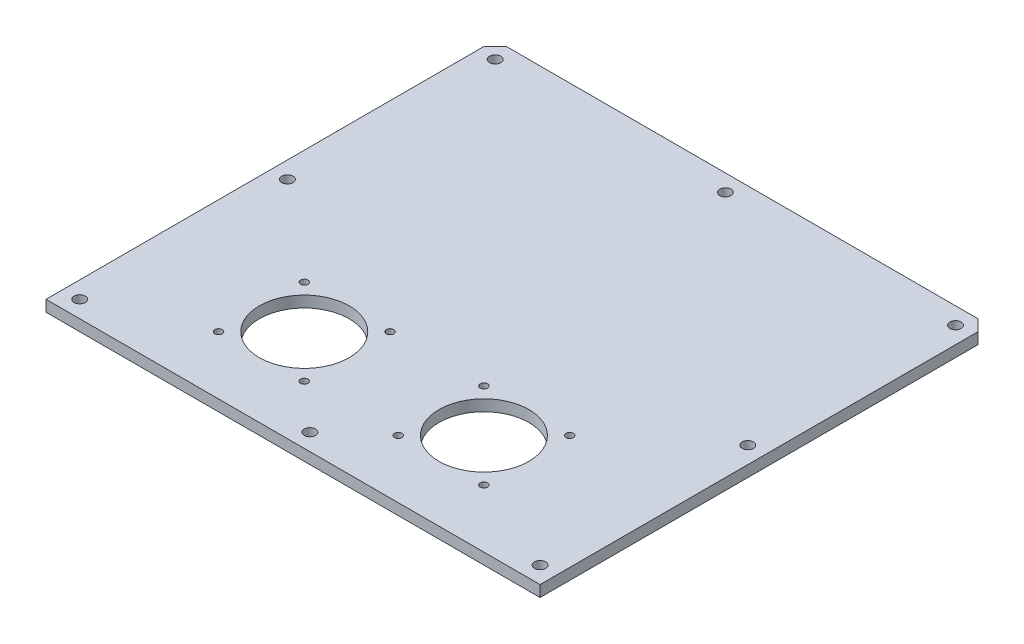
ISO-10303-21;
HEADER;
FILE_DESCRIPTION(('STEP AP214'),'2;1');
FILE_NAME('part.step','',(''),(''),'','','');
FILE_SCHEMA(('AUTOMOTIVE_DESIGN { 1 0 10303 214 1 1 1 1 }'));
ENDSEC;
DATA;
#1=APPLICATION_CONTEXT('core data for automotive mechanical design processes');
#2=APPLICATION_PROTOCOL_DEFINITION('international standard','automotive_design',2000,#1);
#3=PRODUCT_CONTEXT('',#1,'mechanical');
#4=PRODUCT('Part','Part','',(#3));
#5=PRODUCT_RELATED_PRODUCT_CATEGORY('part','',(#4));
#6=PRODUCT_DEFINITION_FORMATION('','',#4);
#7=PRODUCT_DEFINITION_CONTEXT('part definition',#1,'design');
#8=PRODUCT_DEFINITION('design','',#6,#7);
#9=PRODUCT_DEFINITION_SHAPE('','',#8);
#10=(LENGTH_UNIT() NAMED_UNIT(*) SI_UNIT(.MILLI.,.METRE.));
#11=(NAMED_UNIT(*) PLANE_ANGLE_UNIT() SI_UNIT($,.RADIAN.));
#12=(NAMED_UNIT(*) SI_UNIT($,.STERADIAN.) SOLID_ANGLE_UNIT());
#13=UNCERTAINTY_MEASURE_WITH_UNIT(LENGTH_MEASURE(1.E-05),#10,'distance_accuracy_value','');
#14=(GEOMETRIC_REPRESENTATION_CONTEXT(3) GLOBAL_UNCERTAINTY_ASSIGNED_CONTEXT((#13)) GLOBAL_UNIT_ASSIGNED_CONTEXT((#10,
#11,#12)) REPRESENTATION_CONTEXT('',''));
#15=CARTESIAN_POINT('',(0.,0.,0.));
#16=DIRECTION('',(0.,0.,1.));
#17=DIRECTION('',(1.,0.,0.));
#18=AXIS2_PLACEMENT_3D('',#15,#16,#17);
#19=CARTESIAN_POINT('',(0.,0.,0.));
#20=DIRECTION('',(0.,1.,0.));
#21=DIRECTION('',(0.,0.,1.));
#22=AXIS2_PLACEMENT_3D('',#19,#20,#21);
#23=PLANE('',#22);
#24=CARTESIAN_POINT('',(-102.5,0.,-42.5));
#25=DIRECTION('',(0.,1.,0.));
#26=DIRECTION('',(0.,0.,1.));
#27=AXIS2_PLACEMENT_3D('',#24,#25,#26);
#28=CIRCLE('',#27,2.5);
#29=CARTESIAN_POINT('',(-102.5,0.,-40.));
#30=VERTEX_POINT('',#29);
#31=EDGE_CURVE('E857',#30,#30,#28,.T.);
#32=ORIENTED_EDGE('',*,*,#31,.T.);
#33=EDGE_LOOP('',(#32));
#34=FACE_BOUND('',#33,.T.);
#35=CARTESIAN_POINT('',(0.,0.,-42.5));
#36=DIRECTION('',(0.,1.,0.));
#37=DIRECTION('',(0.,0.,1.));
#38=AXIS2_PLACEMENT_3D('',#35,#36,#37);
#39=CIRCLE('',#38,2.49999999999999);
#40=CARTESIAN_POINT('',(0.,0.,-40.));
#41=VERTEX_POINT('',#40);
#42=EDGE_CURVE('E70',#41,#41,#39,.T.);
#43=ORIENTED_EDGE('',*,*,#42,.T.);
#44=EDGE_LOOP('',(#43));
#45=FACE_BOUND('',#44,.T.);
#46=CARTESIAN_POINT('',(102.5,0.,-42.5));
#47=DIRECTION('',(0.,1.,0.));
#48=DIRECTION('',(0.,0.,1.));
#49=AXIS2_PLACEMENT_3D('',#46,#47,#48);
#50=CIRCLE('',#49,2.5);
#51=CARTESIAN_POINT('',(102.5,0.,-40.));
#52=VERTEX_POINT('',#51);
#53=EDGE_CURVE('E324',#52,#52,#50,.T.);
#54=ORIENTED_EDGE('',*,*,#53,.T.);
#55=EDGE_LOOP('',(#54));
#56=FACE_BOUND('',#55,.T.);
#57=CARTESIAN_POINT('',(102.500000000001,0.,49.9999999999971));
#58=DIRECTION('',(0.,1.,0.));
#59=DIRECTION('',(0.,0.,1.));
#60=AXIS2_PLACEMENT_3D('',#57,#58,#59);
#61=CIRCLE('',#60,2.5);
#62=CARTESIAN_POINT('',(102.500000000001,0.,52.4999999999971));
#63=VERTEX_POINT('',#62);
#64=EDGE_CURVE('E331',#63,#63,#61,.T.);
#65=ORIENTED_EDGE('',*,*,#64,.T.);
#66=EDGE_LOOP('',(#65));
#67=FACE_BOUND('',#66,.T.);
#68=CARTESIAN_POINT('',(-102.499999999999,0.,50.));
#69=DIRECTION('',(0.,1.,0.));
#70=DIRECTION('',(0.,0.,1.));
#71=AXIS2_PLACEMENT_3D('',#68,#69,#70);
#72=CIRCLE('',#71,2.5);
#73=CARTESIAN_POINT('',(-102.499999999999,0.,52.5));
#74=VERTEX_POINT('',#73);
#75=EDGE_CURVE('E321',#74,#74,#72,.T.);
#76=ORIENTED_EDGE('',*,*,#75,.T.);
#77=EDGE_LOOP('',(#76));
#78=FACE_BOUND('',#77,.T.);
#79=CARTESIAN_POINT('',(-102.499999999998,0.,142.5));
#80=DIRECTION('',(0.,1.,0.));
#81=DIRECTION('',(0.,0.,1.));
#82=AXIS2_PLACEMENT_3D('',#79,#80,#81);
#83=CIRCLE('',#82,2.5);
#84=CARTESIAN_POINT('',(-102.499999999998,0.,145.));
#85=VERTEX_POINT('',#84);
#86=EDGE_CURVE('E317',#85,#85,#83,.T.);
#87=ORIENTED_EDGE('',*,*,#86,.T.);
#88=EDGE_LOOP('',(#87));
#89=FACE_BOUND('',#88,.T.);
#90=CARTESIAN_POINT('',(1.92901250528621E-12,0.,142.5));
#91=DIRECTION('',(0.,1.,0.));
#92=DIRECTION('',(0.,0.,1.));
#93=AXIS2_PLACEMENT_3D('',#90,#91,#92);
#94=CIRCLE('',#93,2.49999999999999);
#95=CARTESIAN_POINT('',(1.92901250528621E-12,0.,145.));
#96=VERTEX_POINT('',#95);
#97=EDGE_CURVE('E312',#96,#96,#94,.T.);
#98=ORIENTED_EDGE('',*,*,#97,.T.);
#99=EDGE_LOOP('',(#98));
#100=FACE_BOUND('',#99,.T.);
#101=CARTESIAN_POINT('',(102.500000000002,0.,142.5));
#102=DIRECTION('',(0.,1.,0.));
#103=DIRECTION('',(0.,0.,1.));
#104=AXIS2_PLACEMENT_3D('',#101,#102,#103);
#105=CIRCLE('',#104,2.5);
#106=CARTESIAN_POINT('',(102.500000000002,0.,145.));
#107=VERTEX_POINT('',#106);
#108=EDGE_CURVE('E352',#107,#107,#105,.T.);
#109=ORIENTED_EDGE('',*,*,#108,.T.);
#110=EDGE_LOOP('',(#109));
#111=FACE_BOUND('',#110,.T.);
#112=DIRECTION('',(0.,0.,1.));
#113=VECTOR('',#112,1.);
#114=CARTESIAN_POINT('',(-95.,0.,0.));
#115=LINE('',#114,#113);
#116=CARTESIAN_POINT('',(-95.,0.,-35.));
#117=VERTEX_POINT('',#116);
#118=CARTESIAN_POINT('',(-95.,0.,135.));
#119=VERTEX_POINT('',#118);
#120=EDGE_CURVE('E226',#117,#119,#115,.T.);
#121=ORIENTED_EDGE('',*,*,#120,.T.);
#122=DIRECTION('',(1.,0.,0.));
#123=VECTOR('',#122,1.);
#124=CARTESIAN_POINT('',(0.,0.,135.));
#125=LINE('',#124,#123);
#126=CARTESIAN_POINT('',(95.,0.,135.));
#127=VERTEX_POINT('',#126);
#128=EDGE_CURVE('E198',#119,#127,#125,.T.);
#129=ORIENTED_EDGE('',*,*,#128,.T.);
#130=DIRECTION('',(0.,0.,-1.));
#131=VECTOR('',#130,1.);
#132=CARTESIAN_POINT('',(95.,0.,0.));
#133=LINE('',#132,#131);
#134=CARTESIAN_POINT('',(95.,0.,-35.));
#135=VERTEX_POINT('',#134);
#136=EDGE_CURVE('E232',#127,#135,#133,.T.);
#137=ORIENTED_EDGE('',*,*,#136,.T.);
#138=DIRECTION('',(-1.,0.,0.));
#139=VECTOR('',#138,1.);
#140=CARTESIAN_POINT('',(0.,0.,-35.));
#141=LINE('',#140,#139);
#142=EDGE_CURVE('E229',#135,#117,#141,.T.);
#143=ORIENTED_EDGE('',*,*,#142,.T.);
#144=EDGE_LOOP('',(#121,#129,#137,#143));
#145=FACE_BOUND('',#144,.T.);
#146=DIRECTION('',(-1.,0.,0.));
#147=VECTOR('',#146,1.);
#148=CARTESIAN_POINT('',(110.,0.,-50.));
#149=LINE('',#148,#147);
#150=CARTESIAN_POINT('',(105.,0.,-50.));
#151=VERTEX_POINT('',#150);
#152=CARTESIAN_POINT('',(-105.,0.,-50.));
#153=VERTEX_POINT('',#152);
#154=EDGE_CURVE('E248',#151,#153,#149,.T.);
#155=ORIENTED_EDGE('',*,*,#154,.F.);
#156=DIRECTION('',(-0.707106781186546,0.,-0.707106781186549));
#157=VECTOR('',#156,1.);
#158=CARTESIAN_POINT('',(105.,0.,-50.));
#159=LINE('',#158,#157);
#160=CARTESIAN_POINT('',(110.,0.,-45.));
#161=VERTEX_POINT('',#160);
#162=EDGE_CURVE('E276',#151,#161,#159,.F.);
#163=ORIENTED_EDGE('',*,*,#162,.T.);
#164=DIRECTION('',(0.,0.,-1.));
#165=VECTOR('',#164,1.);
#166=CARTESIAN_POINT('',(110.,0.,150.));
#167=LINE('',#166,#165);
#168=CARTESIAN_POINT('',(110.,0.,150.));
#169=VERTEX_POINT('',#168);
#170=EDGE_CURVE('E259',#169,#161,#167,.T.);
#171=ORIENTED_EDGE('',*,*,#170,.F.);
#172=DIRECTION('',(1.,0.,0.));
#173=VECTOR('',#172,1.);
#174=CARTESIAN_POINT('',(-110.,0.,150.));
#175=LINE('',#174,#173);
#176=CARTESIAN_POINT('',(-110.,0.,150.));
#177=VERTEX_POINT('',#176);
#178=EDGE_CURVE('E257',#177,#169,#175,.T.);
#179=ORIENTED_EDGE('',*,*,#178,.F.);
#180=DIRECTION('',(0.,0.,1.));
#181=VECTOR('',#180,1.);
#182=CARTESIAN_POINT('',(-110.,0.,-50.));
#183=LINE('',#182,#181);
#184=CARTESIAN_POINT('',(-110.,0.,-45.));
#185=VERTEX_POINT('',#184);
#186=EDGE_CURVE('E243',#185,#177,#183,.T.);
#187=ORIENTED_EDGE('',*,*,#186,.F.);
#188=DIRECTION('',(-0.707106781186549,0.,0.707106781186546));
#189=VECTOR('',#188,1.);
#190=CARTESIAN_POINT('',(-110.,0.,-45.));
#191=LINE('',#190,#189);
#192=EDGE_CURVE('E274',#185,#153,#191,.F.);
#193=ORIENTED_EDGE('',*,*,#192,.T.);
#194=EDGE_LOOP('',(#155,#163,#171,#179,#187,#193));
#195=FACE_BOUND('',#194,.T.);
#196=ADVANCED_FACE('F66',(#34,#45,#56,#67,#78,#89,#100,#111,#145,#195),#23,.F.);
#197=CARTESIAN_POINT('',(-110.,5.,-50.));
#198=DIRECTION('',(1.,0.,0.));
#199=DIRECTION('',(0.,0.,-1.));
#200=AXIS2_PLACEMENT_3D('',#197,#198,#199);
#201=PLANE('',#200);
#202=DIRECTION('',(0.,0.,1.));
#203=VECTOR('',#202,1.);
#204=CARTESIAN_POINT('',(-110.,5.,-50.));
#205=LINE('',#204,#203);
#206=CARTESIAN_POINT('',(-110.,5.,-45.));
#207=VERTEX_POINT('',#206);
#208=CARTESIAN_POINT('',(-110.,5.,150.));
#209=VERTEX_POINT('',#208);
#210=EDGE_CURVE('E247',#207,#209,#205,.T.);
#211=ORIENTED_EDGE('',*,*,#210,.F.);
#212=DIRECTION('',(0.,-1.,0.));
#213=VECTOR('',#212,1.);
#214=CARTESIAN_POINT('',(-110.,5.,-45.));
#215=LINE('',#214,#213);
#216=EDGE_CURVE('E284',#207,#185,#215,.T.);
#217=ORIENTED_EDGE('',*,*,#216,.T.);
#218=ORIENTED_EDGE('',*,*,#186,.T.);
#219=DIRECTION('',(0.,-1.,0.));
#220=VECTOR('',#219,1.);
#221=CARTESIAN_POINT('',(-110.,5.,150.));
#222=LINE('',#221,#220);
#223=EDGE_CURVE('E266',#209,#177,#222,.T.);
#224=ORIENTED_EDGE('',*,*,#223,.F.);
#225=EDGE_LOOP('',(#211,#217,#218,#224));
#226=FACE_BOUND('',#225,.T.);
#227=ADVANCED_FACE('F406',(#226),#201,.F.);
#228=CARTESIAN_POINT('',(-110.,5.,150.));
#229=DIRECTION('',(0.,0.,-1.));
#230=DIRECTION('',(-1.,0.,0.));
#231=AXIS2_PLACEMENT_3D('',#228,#229,#230);
#232=PLANE('',#231);
#233=ORIENTED_EDGE('',*,*,#178,.T.);
#234=DIRECTION('',(0.,-1.,0.));
#235=VECTOR('',#234,1.);
#236=CARTESIAN_POINT('',(110.,5.,150.));
#237=LINE('',#236,#235);
#238=CARTESIAN_POINT('',(110.,5.,150.));
#239=VERTEX_POINT('',#238);
#240=EDGE_CURVE('E255',#239,#169,#237,.T.);
#241=ORIENTED_EDGE('',*,*,#240,.F.);
#242=DIRECTION('',(1.,0.,0.));
#243=VECTOR('',#242,1.);
#244=CARTESIAN_POINT('',(-110.,5.,150.));
#245=LINE('',#244,#243);
#246=EDGE_CURVE('E250',#209,#239,#245,.T.);
#247=ORIENTED_EDGE('',*,*,#246,.F.);
#248=ORIENTED_EDGE('',*,*,#223,.T.);
#249=EDGE_LOOP('',(#233,#241,#247,#248));
#250=FACE_BOUND('',#249,.T.);
#251=ADVANCED_FACE('F409',(#250),#232,.F.);
#252=CARTESIAN_POINT('',(110.,5.,150.));
#253=DIRECTION('',(-1.,0.,0.));
#254=DIRECTION('',(0.,0.,1.));
#255=AXIS2_PLACEMENT_3D('',#252,#253,#254);
#256=PLANE('',#255);
#257=ORIENTED_EDGE('',*,*,#170,.T.);
#258=DIRECTION('',(0.,1.,0.));
#259=VECTOR('',#258,1.);
#260=CARTESIAN_POINT('',(110.,5.,-45.));
#261=LINE('',#260,#259);
#262=CARTESIAN_POINT('',(110.,5.,-45.));
#263=VERTEX_POINT('',#262);
#264=EDGE_CURVE('E278',#161,#263,#261,.T.);
#265=ORIENTED_EDGE('',*,*,#264,.T.);
#266=DIRECTION('',(0.,0.,-1.));
#267=VECTOR('',#266,1.);
#268=CARTESIAN_POINT('',(110.,5.,150.));
#269=LINE('',#268,#267);
#270=EDGE_CURVE('E252',#239,#263,#269,.T.);
#271=ORIENTED_EDGE('',*,*,#270,.F.);
#272=ORIENTED_EDGE('',*,*,#240,.T.);
#273=EDGE_LOOP('',(#257,#265,#271,#272));
#274=FACE_BOUND('',#273,.T.);
#275=ADVANCED_FACE('F410',(#274),#256,.F.);
#276=CARTESIAN_POINT('',(110.,5.,-50.));
#277=DIRECTION('',(0.,0.,1.));
#278=DIRECTION('',(1.,0.,0.));
#279=AXIS2_PLACEMENT_3D('',#276,#277,#278);
#280=PLANE('',#279);
#281=DIRECTION('',(-1.,0.,0.));
#282=VECTOR('',#281,1.);
#283=CARTESIAN_POINT('',(0.,5.,-50.));
#284=LINE('',#283,#282);
#285=CARTESIAN_POINT('',(105.,5.,-50.));
#286=VERTEX_POINT('',#285);
#287=CARTESIAN_POINT('',(-105.,5.,-50.));
#288=VERTEX_POINT('',#287);
#289=EDGE_CURVE('E244',#286,#288,#284,.T.);
#290=ORIENTED_EDGE('',*,*,#289,.F.);
#291=DIRECTION('',(0.,-1.,0.));
#292=VECTOR('',#291,1.);
#293=CARTESIAN_POINT('',(105.,5.,-50.));
#294=LINE('',#293,#292);
#295=EDGE_CURVE('E271',#286,#151,#294,.T.);
#296=ORIENTED_EDGE('',*,*,#295,.T.);
#297=ORIENTED_EDGE('',*,*,#154,.T.);
#298=DIRECTION('',(0.,1.,0.));
#299=VECTOR('',#298,1.);
#300=CARTESIAN_POINT('',(-105.,5.,-50.));
#301=LINE('',#300,#299);
#302=EDGE_CURVE('E269',#153,#288,#301,.T.);
#303=ORIENTED_EDGE('',*,*,#302,.T.);
#304=EDGE_LOOP('',(#290,#296,#297,#303));
#305=FACE_BOUND('',#304,.T.);
#306=ADVANCED_FACE('F381',(#305),#280,.F.);
#307=CARTESIAN_POINT('',(0.,5.,0.));
#308=DIRECTION('',(0.,1.,0.));
#309=DIRECTION('',(0.,0.,1.));
#310=AXIS2_PLACEMENT_3D('',#307,#308,#309);
#311=PLANE('',#310);
#312=CARTESIAN_POINT('',(-59.0918830920369,5.,85.9081169079554));
#313=DIRECTION('',(0.,1.,0.));
#314=DIRECTION('',(0.,0.,1.));
#315=AXIS2_PLACEMENT_3D('',#312,#313,#314);
#316=CIRCLE('',#315,1.65);
#317=CARTESIAN_POINT('',(-59.0918830920369,5.,87.5581169079554));
#318=VERTEX_POINT('',#317);
#319=EDGE_CURVE('E823',#318,#318,#316,.T.);
#320=ORIENTED_EDGE('',*,*,#319,.F.);
#321=EDGE_LOOP('',(#320));
#322=FACE_BOUND('',#321,.T.);
#323=CARTESIAN_POINT('',(-20.9081169079633,5.,85.9081169079547));
#324=DIRECTION('',(0.,1.,0.));
#325=DIRECTION('',(0.,0.,1.));
#326=AXIS2_PLACEMENT_3D('',#323,#324,#325);
#327=CIRCLE('',#326,1.65);
#328=CARTESIAN_POINT('',(-20.9081169079633,5.,87.5581169079547));
#329=VERTEX_POINT('',#328);
#330=EDGE_CURVE('E825',#329,#329,#327,.T.);
#331=ORIENTED_EDGE('',*,*,#330,.F.);
#332=EDGE_LOOP('',(#331));
#333=FACE_BOUND('',#332,.T.);
#334=CARTESIAN_POINT('',(-20.9081169079628,5.,124.091883092028));
#335=DIRECTION('',(0.,1.,0.));
#336=DIRECTION('',(0.,0.,1.));
#337=AXIS2_PLACEMENT_3D('',#334,#335,#336);
#338=CIRCLE('',#337,1.65);
#339=CARTESIAN_POINT('',(-20.9081169079628,5.,125.741883092028));
#340=VERTEX_POINT('',#339);
#341=EDGE_CURVE('E831',#340,#340,#338,.T.);
#342=ORIENTED_EDGE('',*,*,#341,.F.);
#343=EDGE_LOOP('',(#342));
#344=FACE_BOUND('',#343,.T.);
#345=CARTESIAN_POINT('',(-59.0918830920363,5.,124.091883092029));
#346=DIRECTION('',(0.,1.,0.));
#347=DIRECTION('',(0.,0.,1.));
#348=AXIS2_PLACEMENT_3D('',#345,#346,#347);
#349=CIRCLE('',#348,1.65);
#350=CARTESIAN_POINT('',(-59.0918830920363,5.,125.741883092029));
#351=VERTEX_POINT('',#350);
#352=EDGE_CURVE('E835',#351,#351,#349,.T.);
#353=ORIENTED_EDGE('',*,*,#352,.F.);
#354=EDGE_LOOP('',(#353));
#355=FACE_BOUND('',#354,.T.);
#356=CARTESIAN_POINT('',(20.9081169079631,5.,85.9081169079554));
#357=DIRECTION('',(0.,1.,0.));
#358=DIRECTION('',(0.,0.,1.));
#359=AXIS2_PLACEMENT_3D('',#356,#357,#358);
#360=CIRCLE('',#359,1.65);
#361=CARTESIAN_POINT('',(20.9081169079631,5.,87.5581169079554));
#362=VERTEX_POINT('',#361);
#363=EDGE_CURVE('E839',#362,#362,#360,.T.);
#364=ORIENTED_EDGE('',*,*,#363,.F.);
#365=EDGE_LOOP('',(#364));
#366=FACE_BOUND('',#365,.T.);
#367=CARTESIAN_POINT('',(59.0918830920367,5.,85.9081169079547));
#368=DIRECTION('',(0.,1.,0.));
#369=DIRECTION('',(0.,0.,1.));
#370=AXIS2_PLACEMENT_3D('',#367,#368,#369);
#371=CIRCLE('',#370,1.65);
#372=CARTESIAN_POINT('',(59.0918830920367,5.,87.5581169079547));
#373=VERTEX_POINT('',#372);
#374=EDGE_CURVE('E843',#373,#373,#371,.T.);
#375=ORIENTED_EDGE('',*,*,#374,.F.);
#376=EDGE_LOOP('',(#375));
#377=FACE_BOUND('',#376,.T.);
#378=CARTESIAN_POINT('',(59.0918830920372,5.,124.091883092028));
#379=DIRECTION('',(0.,1.,0.));
#380=DIRECTION('',(0.,0.,1.));
#381=AXIS2_PLACEMENT_3D('',#378,#379,#380);
#382=CIRCLE('',#381,1.65);
#383=CARTESIAN_POINT('',(59.0918830920372,5.,125.741883092028));
#384=VERTEX_POINT('',#383);
#385=EDGE_CURVE('E847',#384,#384,#382,.T.);
#386=ORIENTED_EDGE('',*,*,#385,.F.);
#387=EDGE_LOOP('',(#386));
#388=FACE_BOUND('',#387,.T.);
#389=CARTESIAN_POINT('',(20.9081169079637,5.,124.091883092029));
#390=DIRECTION('',(0.,1.,0.));
#391=DIRECTION('',(0.,0.,1.));
#392=AXIS2_PLACEMENT_3D('',#389,#390,#391);
#393=CIRCLE('',#392,1.65);
#394=CARTESIAN_POINT('',(20.9081169079637,5.,125.741883092029));
#395=VERTEX_POINT('',#394);
#396=EDGE_CURVE('E851',#395,#395,#393,.T.);
#397=ORIENTED_EDGE('',*,*,#396,.F.);
#398=EDGE_LOOP('',(#397));
#399=FACE_BOUND('',#398,.T.);
#400=CARTESIAN_POINT('',(-102.5,5.,-42.5));
#401=DIRECTION('',(0.,1.,0.));
#402=DIRECTION('',(0.,0.,1.));
#403=AXIS2_PLACEMENT_3D('',#400,#401,#402);
#404=CIRCLE('',#403,2.49999999999999);
#405=CARTESIAN_POINT('',(-102.5,5.,-40.));
#406=VERTEX_POINT('',#405);
#407=EDGE_CURVE('E855',#406,#406,#404,.T.);
#408=ORIENTED_EDGE('',*,*,#407,.F.);
#409=EDGE_LOOP('',(#408));
#410=FACE_BOUND('',#409,.T.);
#411=CARTESIAN_POINT('',(0.,5.,-42.5));
#412=DIRECTION('',(0.,1.,0.));
#413=DIRECTION('',(0.,0.,1.));
#414=AXIS2_PLACEMENT_3D('',#411,#412,#413);
#415=CIRCLE('',#414,2.49999999999999);
#416=CARTESIAN_POINT('',(0.,5.,-40.));
#417=VERTEX_POINT('',#416);
#418=EDGE_CURVE('E338',#417,#417,#415,.T.);
#419=ORIENTED_EDGE('',*,*,#418,.F.);
#420=EDGE_LOOP('',(#419));
#421=FACE_BOUND('',#420,.T.);
#422=CARTESIAN_POINT('',(102.5,5.,-42.5));
#423=DIRECTION('',(0.,1.,0.));
#424=DIRECTION('',(0.,0.,1.));
#425=AXIS2_PLACEMENT_3D('',#422,#423,#424);
#426=CIRCLE('',#425,2.49999999999999);
#427=CARTESIAN_POINT('',(102.5,5.,-40.));
#428=VERTEX_POINT('',#427);
#429=EDGE_CURVE('E327',#428,#428,#426,.T.);
#430=ORIENTED_EDGE('',*,*,#429,.F.);
#431=EDGE_LOOP('',(#430));
#432=FACE_BOUND('',#431,.T.);
#433=CARTESIAN_POINT('',(102.500000000001,5.,49.9999999999971));
#434=DIRECTION('',(0.,1.,0.));
#435=DIRECTION('',(0.,0.,1.));
#436=AXIS2_PLACEMENT_3D('',#433,#434,#435);
#437=CIRCLE('',#436,2.49999999999999);
#438=CARTESIAN_POINT('',(102.500000000001,5.,52.4999999999971));
#439=VERTEX_POINT('',#438);
#440=EDGE_CURVE('E326',#439,#439,#437,.T.);
#441=ORIENTED_EDGE('',*,*,#440,.F.);
#442=EDGE_LOOP('',(#441));
#443=FACE_BOUND('',#442,.T.);
#444=CARTESIAN_POINT('',(-102.499999999999,5.,50.));
#445=DIRECTION('',(0.,1.,0.));
#446=DIRECTION('',(0.,0.,1.));
#447=AXIS2_PLACEMENT_3D('',#444,#445,#446);
#448=CIRCLE('',#447,2.49999999999999);
#449=CARTESIAN_POINT('',(-102.499999999999,5.,52.5));
#450=VERTEX_POINT('',#449);
#451=EDGE_CURVE('E323',#450,#450,#448,.T.);
#452=ORIENTED_EDGE('',*,*,#451,.F.);
#453=EDGE_LOOP('',(#452));
#454=FACE_BOUND('',#453,.T.);
#455=CARTESIAN_POINT('',(-102.499999999998,5.,142.5));
#456=DIRECTION('',(0.,1.,0.));
#457=DIRECTION('',(0.,0.,1.));
#458=AXIS2_PLACEMENT_3D('',#455,#456,#457);
#459=CIRCLE('',#458,2.49999999999999);
#460=CARTESIAN_POINT('',(-102.499999999998,5.,145.));
#461=VERTEX_POINT('',#460);
#462=EDGE_CURVE('E320',#461,#461,#459,.T.);
#463=ORIENTED_EDGE('',*,*,#462,.F.);
#464=EDGE_LOOP('',(#463));
#465=FACE_BOUND('',#464,.T.);
#466=CARTESIAN_POINT('',(1.92901250528621E-12,5.,142.5));
#467=DIRECTION('',(0.,1.,0.));
#468=DIRECTION('',(0.,0.,1.));
#469=AXIS2_PLACEMENT_3D('',#466,#467,#468);
#470=CIRCLE('',#469,2.49999999999999);
#471=CARTESIAN_POINT('',(1.92901250528621E-12,5.,145.));
#472=VERTEX_POINT('',#471);
#473=EDGE_CURVE('E316',#472,#472,#470,.T.);
#474=ORIENTED_EDGE('',*,*,#473,.F.);
#475=EDGE_LOOP('',(#474));
#476=FACE_BOUND('',#475,.T.);
#477=CARTESIAN_POINT('',(102.500000000002,5.,142.5));
#478=DIRECTION('',(0.,1.,0.));
#479=DIRECTION('',(0.,0.,1.));
#480=AXIS2_PLACEMENT_3D('',#477,#478,#479);
#481=CIRCLE('',#480,2.49999999999999);
#482=CARTESIAN_POINT('',(102.500000000002,5.,145.));
#483=VERTEX_POINT('',#482);
#484=EDGE_CURVE('E315',#483,#483,#481,.T.);
#485=ORIENTED_EDGE('',*,*,#484,.F.);
#486=EDGE_LOOP('',(#485));
#487=FACE_BOUND('',#486,.T.);
#488=CARTESIAN_POINT('',(-40.,5.,104.999999999992));
#489=DIRECTION('',(0.,1.,0.));
#490=DIRECTION('',(0.,0.,1.));
#491=AXIS2_PLACEMENT_3D('',#488,#489,#490);
#492=CIRCLE('',#491,20.);
#493=CARTESIAN_POINT('',(-40.,5.,124.999999999992));
#494=VERTEX_POINT('',#493);
#495=EDGE_CURVE('E358',#494,#494,#492,.T.);
#496=ORIENTED_EDGE('',*,*,#495,.F.);
#497=EDGE_LOOP('',(#496));
#498=FACE_BOUND('',#497,.T.);
#499=CARTESIAN_POINT('',(40.,5.,104.999999999992));
#500=DIRECTION('',(0.,1.,0.));
#501=DIRECTION('',(0.,0.,1.));
#502=AXIS2_PLACEMENT_3D('',#499,#500,#501);
#503=CIRCLE('',#502,20.);
#504=CARTESIAN_POINT('',(40.,5.,124.999999999992));
#505=VERTEX_POINT('',#504);
#506=EDGE_CURVE('E361',#505,#505,#503,.T.);
#507=ORIENTED_EDGE('',*,*,#506,.F.);
#508=EDGE_LOOP('',(#507));
#509=FACE_BOUND('',#508,.T.);
#510=ORIENTED_EDGE('',*,*,#270,.T.);
#511=DIRECTION('',(0.707106781186546,0.,0.707106781186549));
#512=VECTOR('',#511,1.);
#513=CARTESIAN_POINT('',(77.5000000000002,5.,-77.4999999999999));
#514=LINE('',#513,#512);
#515=EDGE_CURVE('E282',#263,#286,#514,.F.);
#516=ORIENTED_EDGE('',*,*,#515,.T.);
#517=ORIENTED_EDGE('',*,*,#289,.T.);
#518=DIRECTION('',(0.707106781186549,0.,-0.707106781186546));
#519=VECTOR('',#518,1.);
#520=CARTESIAN_POINT('',(-77.4999999999997,5.,-77.5000000000001));
#521=LINE('',#520,#519);
#522=EDGE_CURVE('E280',#288,#207,#521,.F.);
#523=ORIENTED_EDGE('',*,*,#522,.T.);
#524=ORIENTED_EDGE('',*,*,#210,.T.);
#525=ORIENTED_EDGE('',*,*,#246,.T.);
#526=EDGE_LOOP('',(#510,#516,#517,#523,#524,#525));
#527=FACE_BOUND('',#526,.T.);
#528=ADVANCED_FACE('F377',(#322,#333,#344,#355,#366,#377,#388,#399,#410,#421,#432,#443,#454,
#465,#476,#487,#498,#509,#527),#311,.T.);
#529=CARTESIAN_POINT('',(105.,5.,-50.));
#530=DIRECTION('',(-0.707106781186549,0.,0.707106781186546));
#531=DIRECTION('',(0.,-1.,0.));
#532=AXIS2_PLACEMENT_3D('',#529,#530,#531);
#533=PLANE('',#532);
#534=ORIENTED_EDGE('',*,*,#515,.F.);
#535=ORIENTED_EDGE('',*,*,#264,.F.);
#536=ORIENTED_EDGE('',*,*,#162,.F.);
#537=ORIENTED_EDGE('',*,*,#295,.F.);
#538=EDGE_LOOP('',(#534,#535,#536,#537));
#539=FACE_BOUND('',#538,.T.);
#540=ADVANCED_FACE('F380',(#539),#533,.F.);
#541=CARTESIAN_POINT('',(-110.,5.,-45.));
#542=DIRECTION('',(0.707106781186545,0.,0.707106781186549));
#543=DIRECTION('',(0.,-1.,0.));
#544=AXIS2_PLACEMENT_3D('',#541,#542,#543);
#545=PLANE('',#544);
#546=ORIENTED_EDGE('',*,*,#522,.F.);
#547=ORIENTED_EDGE('',*,*,#302,.F.);
#548=ORIENTED_EDGE('',*,*,#192,.F.);
#549=ORIENTED_EDGE('',*,*,#216,.F.);
#550=EDGE_LOOP('',(#546,#547,#548,#549));
#551=FACE_BOUND('',#550,.T.);
#552=ADVANCED_FACE('F403',(#551),#545,.F.);
#553=CARTESIAN_POINT('',(0.,-5.,0.));
#554=DIRECTION('',(0.,-1.,0.));
#555=DIRECTION('',(0.,0.,-1.));
#556=AXIS2_PLACEMENT_3D('',#553,#554,#555);
#557=PLANE('',#556);
#558=DIRECTION('',(0.,0.,-1.));
#559=VECTOR('',#558,1.);
#560=CARTESIAN_POINT('',(-93.,-5.,0.));
#561=LINE('',#560,#559);
#562=CARTESIAN_POINT('',(-93.,-5.,133.));
#563=VERTEX_POINT('',#562);
#564=CARTESIAN_POINT('',(-93.,-5.,-33.));
#565=VERTEX_POINT('',#564);
#566=EDGE_CURVE('E292',#563,#565,#561,.T.);
#567=ORIENTED_EDGE('',*,*,#566,.T.);
#568=DIRECTION('',(1.,0.,0.));
#569=VECTOR('',#568,1.);
#570=CARTESIAN_POINT('',(0.,-5.,-33.));
#571=LINE('',#570,#569);
#572=CARTESIAN_POINT('',(93.,-5.,-33.));
#573=VERTEX_POINT('',#572);
#574=EDGE_CURVE('E296',#565,#573,#571,.T.);
#575=ORIENTED_EDGE('',*,*,#574,.T.);
#576=DIRECTION('',(0.,0.,1.));
#577=VECTOR('',#576,1.);
#578=CARTESIAN_POINT('',(93.,-5.,0.));
#579=LINE('',#578,#577);
#580=CARTESIAN_POINT('',(93.,-5.,133.));
#581=VERTEX_POINT('',#580);
#582=EDGE_CURVE('E294',#573,#581,#579,.T.);
#583=ORIENTED_EDGE('',*,*,#582,.T.);
#584=DIRECTION('',(-1.,0.,0.));
#585=VECTOR('',#584,1.);
#586=CARTESIAN_POINT('',(0.,-5.,133.));
#587=LINE('',#586,#585);
#588=EDGE_CURVE('E290',#581,#563,#587,.T.);
#589=ORIENTED_EDGE('',*,*,#588,.T.);
#590=EDGE_LOOP('',(#567,#575,#583,#589));
#591=FACE_BOUND('',#590,.T.);
#592=DIRECTION('',(0.,0.,-1.));
#593=VECTOR('',#592,1.);
#594=CARTESIAN_POINT('',(-90.,-5.,130.));
#595=LINE('',#594,#593);
#596=CARTESIAN_POINT('',(-90.,-5.,130.));
#597=VERTEX_POINT('',#596);
#598=CARTESIAN_POINT('',(-90.,-5.,-30.));
#599=VERTEX_POINT('',#598);
#600=EDGE_CURVE('E189',#597,#599,#595,.T.);
#601=ORIENTED_EDGE('',*,*,#600,.F.);
#602=DIRECTION('',(-1.,0.,0.));
#603=VECTOR('',#602,1.);
#604=CARTESIAN_POINT('',(90.,-5.,130.));
#605=LINE('',#604,#603);
#606=CARTESIAN_POINT('',(90.,-5.,130.));
#607=VERTEX_POINT('',#606);
#608=EDGE_CURVE('E179',#607,#597,#605,.T.);
#609=ORIENTED_EDGE('',*,*,#608,.F.);
#610=DIRECTION('',(0.,0.,1.));
#611=VECTOR('',#610,1.);
#612=CARTESIAN_POINT('',(90.,-5.,-30.));
#613=LINE('',#612,#611);
#614=CARTESIAN_POINT('',(90.,-5.,-30.));
#615=VERTEX_POINT('',#614);
#616=EDGE_CURVE('E206',#615,#607,#613,.T.);
#617=ORIENTED_EDGE('',*,*,#616,.F.);
#618=DIRECTION('',(1.,0.,0.));
#619=VECTOR('',#618,1.);
#620=CARTESIAN_POINT('',(-90.,-5.,-30.));
#621=LINE('',#620,#619);
#622=EDGE_CURVE('E204',#599,#615,#621,.T.);
#623=ORIENTED_EDGE('',*,*,#622,.F.);
#624=EDGE_LOOP('',(#601,#609,#617,#623));
#625=FACE_BOUND('',#624,.T.);
#626=ADVANCED_FACE('F202',(#591,#625),#557,.T.);
#627=CARTESIAN_POINT('',(0.,-5.,135.));
#628=DIRECTION('',(0.,0.,1.));
#629=DIRECTION('',(1.,0.,0.));
#630=AXIS2_PLACEMENT_3D('',#627,#628,#629);
#631=PLANE('',#630);
#632=DIRECTION('',(0.,1.,0.));
#633=VECTOR('',#632,1.);
#634=CARTESIAN_POINT('',(-95.,-5.,135.));
#635=LINE('',#634,#633);
#636=CARTESIAN_POINT('',(-95.,-3.00000000000003,135.));
#637=VERTEX_POINT('',#636);
#638=EDGE_CURVE('E241',#637,#119,#635,.T.);
#639=ORIENTED_EDGE('',*,*,#638,.F.);
#640=DIRECTION('',(1.,0.,0.));
#641=VECTOR('',#640,1.);
#642=CARTESIAN_POINT('',(0.,-3.00000000000003,135.));
#643=LINE('',#642,#641);
#644=CARTESIAN_POINT('',(95.,-3.00000000000003,135.));
#645=VERTEX_POINT('',#644);
#646=EDGE_CURVE('E12',#637,#645,#643,.T.);
#647=ORIENTED_EDGE('',*,*,#646,.T.);
#648=DIRECTION('',(0.,1.,0.));
#649=VECTOR('',#648,1.);
#650=CARTESIAN_POINT('',(95.,-5.,135.));
#651=LINE('',#650,#649);
#652=EDGE_CURVE('E235',#645,#127,#651,.T.);
#653=ORIENTED_EDGE('',*,*,#652,.T.);
#654=ORIENTED_EDGE('',*,*,#128,.F.);
#655=EDGE_LOOP('',(#639,#647,#653,#654));
#656=FACE_BOUND('',#655,.T.);
#657=ADVANCED_FACE('F498',(#656),#631,.T.);
#658=CARTESIAN_POINT('',(-95.,-5.,0.));
#659=DIRECTION('',(-1.,0.,0.));
#660=DIRECTION('',(0.,0.,1.));
#661=AXIS2_PLACEMENT_3D('',#658,#659,#660);
#662=PLANE('',#661);
#663=DIRECTION('',(0.,1.,0.));
#664=VECTOR('',#663,1.);
#665=CARTESIAN_POINT('',(-95.,-5.,-35.));
#666=LINE('',#665,#664);
#667=CARTESIAN_POINT('',(-95.,-3.00000000000003,-35.));
#668=VERTEX_POINT('',#667);
#669=EDGE_CURVE('E239',#668,#117,#666,.T.);
#670=ORIENTED_EDGE('',*,*,#669,.F.);
#671=DIRECTION('',(0.,0.,1.));
#672=VECTOR('',#671,1.);
#673=CARTESIAN_POINT('',(-95.,-3.00000000000003,0.));
#674=LINE('',#673,#672);
#675=EDGE_CURVE('E75',#668,#637,#674,.T.);
#676=ORIENTED_EDGE('',*,*,#675,.T.);
#677=ORIENTED_EDGE('',*,*,#638,.T.);
#678=ORIENTED_EDGE('',*,*,#120,.F.);
#679=EDGE_LOOP('',(#670,#676,#677,#678));
#680=FACE_BOUND('',#679,.T.);
#681=ADVANCED_FACE('F506',(#680),#662,.T.);
#682=CARTESIAN_POINT('',(0.,-5.,-35.));
#683=DIRECTION('',(0.,0.,-1.));
#684=DIRECTION('',(-1.,0.,0.));
#685=AXIS2_PLACEMENT_3D('',#682,#683,#684);
#686=PLANE('',#685);
#687=DIRECTION('',(0.,1.,0.));
#688=VECTOR('',#687,1.);
#689=CARTESIAN_POINT('',(95.,-5.,-35.));
#690=LINE('',#689,#688);
#691=CARTESIAN_POINT('',(95.,-3.00000000000003,-35.));
#692=VERTEX_POINT('',#691);
#693=EDGE_CURVE('E237',#692,#135,#690,.T.);
#694=ORIENTED_EDGE('',*,*,#693,.F.);
#695=DIRECTION('',(-1.,0.,0.));
#696=VECTOR('',#695,1.);
#697=CARTESIAN_POINT('',(0.,-3.00000000000003,-35.));
#698=LINE('',#697,#696);
#699=EDGE_CURVE('E287',#692,#668,#698,.T.);
#700=ORIENTED_EDGE('',*,*,#699,.T.);
#701=ORIENTED_EDGE('',*,*,#669,.T.);
#702=ORIENTED_EDGE('',*,*,#142,.F.);
#703=EDGE_LOOP('',(#694,#700,#701,#702));
#704=FACE_BOUND('',#703,.T.);
#705=ADVANCED_FACE('F502',(#704),#686,.T.);
#706=CARTESIAN_POINT('',(95.,-5.,0.));
#707=DIRECTION('',(1.,0.,0.));
#708=DIRECTION('',(0.,0.,-1.));
#709=AXIS2_PLACEMENT_3D('',#706,#707,#708);
#710=PLANE('',#709);
#711=ORIENTED_EDGE('',*,*,#652,.F.);
#712=DIRECTION('',(0.,0.,-1.));
#713=VECTOR('',#712,1.);
#714=CARTESIAN_POINT('',(95.,-3.00000000000003,0.));
#715=LINE('',#714,#713);
#716=EDGE_CURVE('E299',#645,#692,#715,.T.);
#717=ORIENTED_EDGE('',*,*,#716,.T.);
#718=ORIENTED_EDGE('',*,*,#693,.T.);
#719=ORIENTED_EDGE('',*,*,#136,.F.);
#720=EDGE_LOOP('',(#711,#717,#718,#719));
#721=FACE_BOUND('',#720,.T.);
#722=ADVANCED_FACE('F495',(#721),#710,.T.);
#723=CARTESIAN_POINT('',(0.,-5.,130.));
#724=DIRECTION('',(0.,0.,-1.));
#725=DIRECTION('',(-1.,0.,0.));
#726=AXIS2_PLACEMENT_3D('',#723,#724,#725);
#727=PLANE('',#726);
#728=DIRECTION('',(-1.,0.,0.));
#729=VECTOR('',#728,1.);
#730=CARTESIAN_POINT('',(0.,0.,130.));
#731=LINE('',#730,#729);
#732=CARTESIAN_POINT('',(90.,0.,130.));
#733=VERTEX_POINT('',#732);
#734=CARTESIAN_POINT('',(-90.,0.,130.));
#735=VERTEX_POINT('',#734);
#736=EDGE_CURVE('E211',#733,#735,#731,.T.);
#737=ORIENTED_EDGE('',*,*,#736,.F.);
#738=DIRECTION('',(0.,1.,0.));
#739=VECTOR('',#738,1.);
#740=CARTESIAN_POINT('',(90.,-5.,130.));
#741=LINE('',#740,#739);
#742=EDGE_CURVE('E185',#607,#733,#741,.T.);
#743=ORIENTED_EDGE('',*,*,#742,.F.);
#744=ORIENTED_EDGE('',*,*,#608,.T.);
#745=DIRECTION('',(0.,1.,0.));
#746=VECTOR('',#745,1.);
#747=CARTESIAN_POINT('',(-90.,-5.,130.));
#748=LINE('',#747,#746);
#749=EDGE_CURVE('E182',#597,#735,#748,.T.);
#750=ORIENTED_EDGE('',*,*,#749,.T.);
#751=EDGE_LOOP('',(#737,#743,#744,#750));
#752=FACE_BOUND('',#751,.T.);
#753=ADVANCED_FACE('F181',(#752),#727,.T.);
#754=CARTESIAN_POINT('',(-90.,-5.,130.));
#755=DIRECTION('',(1.,0.,0.));
#756=DIRECTION('',(0.,0.,-1.));
#757=AXIS2_PLACEMENT_3D('',#754,#755,#756);
#758=PLANE('',#757);
#759=DIRECTION('',(0.,0.,-1.));
#760=VECTOR('',#759,1.);
#761=CARTESIAN_POINT('',(-90.,0.,130.));
#762=LINE('',#761,#760);
#763=CARTESIAN_POINT('',(-90.,0.,-30.));
#764=VERTEX_POINT('',#763);
#765=EDGE_CURVE('E196',#735,#764,#762,.T.);
#766=ORIENTED_EDGE('',*,*,#765,.F.);
#767=ORIENTED_EDGE('',*,*,#749,.F.);
#768=ORIENTED_EDGE('',*,*,#600,.T.);
#769=DIRECTION('',(0.,1.,0.));
#770=VECTOR('',#769,1.);
#771=CARTESIAN_POINT('',(-90.,-5.,-30.));
#772=LINE('',#771,#770);
#773=EDGE_CURVE('E199',#599,#764,#772,.T.);
#774=ORIENTED_EDGE('',*,*,#773,.T.);
#775=EDGE_LOOP('',(#766,#767,#768,#774));
#776=FACE_BOUND('',#775,.T.);
#777=ADVANCED_FACE('F193',(#776),#758,.T.);
#778=CARTESIAN_POINT('',(-90.,-5.,-30.));
#779=DIRECTION('',(0.,0.,1.));
#780=DIRECTION('',(1.,0.,0.));
#781=AXIS2_PLACEMENT_3D('',#778,#779,#780);
#782=PLANE('',#781);
#783=DIRECTION('',(1.,0.,0.));
#784=VECTOR('',#783,1.);
#785=CARTESIAN_POINT('',(-90.,0.,-30.));
#786=LINE('',#785,#784);
#787=CARTESIAN_POINT('',(90.,0.,-30.));
#788=VERTEX_POINT('',#787);
#789=EDGE_CURVE('E215',#764,#788,#786,.T.);
#790=ORIENTED_EDGE('',*,*,#789,.F.);
#791=ORIENTED_EDGE('',*,*,#773,.F.);
#792=ORIENTED_EDGE('',*,*,#622,.T.);
#793=DIRECTION('',(0.,1.,0.));
#794=VECTOR('',#793,1.);
#795=CARTESIAN_POINT('',(90.,-5.,-30.));
#796=LINE('',#795,#794);
#797=EDGE_CURVE('E221',#615,#788,#796,.T.);
#798=ORIENTED_EDGE('',*,*,#797,.T.);
#799=EDGE_LOOP('',(#790,#791,#792,#798));
#800=FACE_BOUND('',#799,.T.);
#801=ADVANCED_FACE('F437',(#800),#782,.T.);
#802=CARTESIAN_POINT('',(90.,-5.,-30.));
#803=DIRECTION('',(-1.,0.,0.));
#804=DIRECTION('',(0.,0.,1.));
#805=AXIS2_PLACEMENT_3D('',#802,#803,#804);
#806=PLANE('',#805);
#807=DIRECTION('',(0.,0.,1.));
#808=VECTOR('',#807,1.);
#809=CARTESIAN_POINT('',(90.,0.,-30.));
#810=LINE('',#809,#808);
#811=EDGE_CURVE('E190',#788,#733,#810,.T.);
#812=ORIENTED_EDGE('',*,*,#811,.F.);
#813=ORIENTED_EDGE('',*,*,#797,.F.);
#814=ORIENTED_EDGE('',*,*,#616,.T.);
#815=ORIENTED_EDGE('',*,*,#742,.T.);
#816=EDGE_LOOP('',(#812,#813,#814,#815));
#817=FACE_BOUND('',#816,.T.);
#818=ADVANCED_FACE('F429',(#817),#806,.T.);
#819=CARTESIAN_POINT('',(-59.0918830920369,0.,85.9081169079554));
#820=DIRECTION('',(0.,1.,0.));
#821=DIRECTION('',(0.,0.,1.));
#822=AXIS2_PLACEMENT_3D('',#819,#820,#821);
#823=CIRCLE('',#822,1.65);
#824=CARTESIAN_POINT('',(-59.0918830920369,0.,87.5581169079554));
#825=VERTEX_POINT('',#824);
#826=EDGE_CURVE('E443',#825,#825,#823,.T.);
#827=ORIENTED_EDGE('',*,*,#826,.T.);
#828=EDGE_LOOP('',(#827));
#829=FACE_BOUND('',#828,.T.);
#830=CARTESIAN_POINT('',(-20.9081169079633,0.,85.9081169079547));
#831=DIRECTION('',(0.,1.,0.));
#832=DIRECTION('',(0.,0.,1.));
#833=AXIS2_PLACEMENT_3D('',#830,#831,#832);
#834=CIRCLE('',#833,1.65);
#835=CARTESIAN_POINT('',(-20.9081169079633,0.,87.5581169079547));
#836=VERTEX_POINT('',#835);
#837=EDGE_CURVE('E447',#836,#836,#834,.T.);
#838=ORIENTED_EDGE('',*,*,#837,.T.);
#839=EDGE_LOOP('',(#838));
#840=FACE_BOUND('',#839,.T.);
#841=CARTESIAN_POINT('',(-20.9081169079628,0.,124.091883092028));
#842=DIRECTION('',(0.,1.,0.));
#843=DIRECTION('',(0.,0.,1.));
#844=AXIS2_PLACEMENT_3D('',#841,#842,#843);
#845=CIRCLE('',#844,1.65);
#846=CARTESIAN_POINT('',(-20.9081169079628,0.,125.741883092028));
#847=VERTEX_POINT('',#846);
#848=EDGE_CURVE('E451',#847,#847,#845,.T.);
#849=ORIENTED_EDGE('',*,*,#848,.T.);
#850=EDGE_LOOP('',(#849));
#851=FACE_BOUND('',#850,.T.);
#852=CARTESIAN_POINT('',(-59.0918830920363,0.,124.091883092029));
#853=DIRECTION('',(0.,1.,0.));
#854=DIRECTION('',(0.,0.,1.));
#855=AXIS2_PLACEMENT_3D('',#852,#853,#854);
#856=CIRCLE('',#855,1.65);
#857=CARTESIAN_POINT('',(-59.0918830920363,0.,125.741883092029));
#858=VERTEX_POINT('',#857);
#859=EDGE_CURVE('E455',#858,#858,#856,.T.);
#860=ORIENTED_EDGE('',*,*,#859,.T.);
#861=EDGE_LOOP('',(#860));
#862=FACE_BOUND('',#861,.T.);
#863=CARTESIAN_POINT('',(20.9081169079631,0.,85.9081169079554));
#864=DIRECTION('',(0.,1.,0.));
#865=DIRECTION('',(0.,0.,1.));
#866=AXIS2_PLACEMENT_3D('',#863,#864,#865);
#867=CIRCLE('',#866,1.65);
#868=CARTESIAN_POINT('',(20.9081169079631,0.,87.5581169079554));
#869=VERTEX_POINT('',#868);
#870=EDGE_CURVE('E459',#869,#869,#867,.T.);
#871=ORIENTED_EDGE('',*,*,#870,.T.);
#872=EDGE_LOOP('',(#871));
#873=FACE_BOUND('',#872,.T.);
#874=CARTESIAN_POINT('',(59.0918830920367,0.,85.9081169079547));
#875=DIRECTION('',(0.,1.,0.));
#876=DIRECTION('',(0.,0.,1.));
#877=AXIS2_PLACEMENT_3D('',#874,#875,#876);
#878=CIRCLE('',#877,1.65);
#879=CARTESIAN_POINT('',(59.0918830920367,0.,87.5581169079547));
#880=VERTEX_POINT('',#879);
#881=EDGE_CURVE('E463',#880,#880,#878,.T.);
#882=ORIENTED_EDGE('',*,*,#881,.T.);
#883=EDGE_LOOP('',(#882));
#884=FACE_BOUND('',#883,.T.);
#885=CARTESIAN_POINT('',(59.0918830920372,0.,124.091883092028));
#886=DIRECTION('',(0.,1.,0.));
#887=DIRECTION('',(0.,0.,1.));
#888=AXIS2_PLACEMENT_3D('',#885,#886,#887);
#889=CIRCLE('',#888,1.65);
#890=CARTESIAN_POINT('',(59.0918830920372,0.,125.741883092028));
#891=VERTEX_POINT('',#890);
#892=EDGE_CURVE('E467',#891,#891,#889,.T.);
#893=ORIENTED_EDGE('',*,*,#892,.T.);
#894=EDGE_LOOP('',(#893));
#895=FACE_BOUND('',#894,.T.);
#896=CARTESIAN_POINT('',(20.9081169079637,0.,124.091883092029));
#897=DIRECTION('',(0.,1.,0.));
#898=DIRECTION('',(0.,0.,1.));
#899=AXIS2_PLACEMENT_3D('',#896,#897,#898);
#900=CIRCLE('',#899,1.65);
#901=CARTESIAN_POINT('',(20.9081169079637,0.,125.741883092029));
#902=VERTEX_POINT('',#901);
#903=EDGE_CURVE('E471',#902,#902,#900,.T.);
#904=ORIENTED_EDGE('',*,*,#903,.T.);
#905=EDGE_LOOP('',(#904));
#906=FACE_BOUND('',#905,.T.);
#907=CARTESIAN_POINT('',(-40.,0.,104.999999999992));
#908=DIRECTION('',(0.,1.,0.));
#909=DIRECTION('',(0.,0.,1.));
#910=AXIS2_PLACEMENT_3D('',#907,#908,#909);
#911=CIRCLE('',#910,20.);
#912=CARTESIAN_POINT('',(-40.,0.,124.999999999992));
#913=VERTEX_POINT('',#912);
#914=EDGE_CURVE('E305',#913,#913,#911,.T.);
#915=ORIENTED_EDGE('',*,*,#914,.T.);
#916=EDGE_LOOP('',(#915));
#917=FACE_BOUND('',#916,.T.);
#918=CARTESIAN_POINT('',(40.,0.,104.999999999992));
#919=DIRECTION('',(0.,1.,0.));
#920=DIRECTION('',(0.,0.,1.));
#921=AXIS2_PLACEMENT_3D('',#918,#919,#920);
#922=CIRCLE('',#921,20.);
#923=CARTESIAN_POINT('',(40.,0.,124.999999999992));
#924=VERTEX_POINT('',#923);
#925=EDGE_CURVE('E355',#924,#924,#922,.T.);
#926=ORIENTED_EDGE('',*,*,#925,.T.);
#927=EDGE_LOOP('',(#926));
#928=FACE_BOUND('',#927,.T.);
#929=ORIENTED_EDGE('',*,*,#811,.T.);
#930=ORIENTED_EDGE('',*,*,#736,.T.);
#931=ORIENTED_EDGE('',*,*,#765,.T.);
#932=ORIENTED_EDGE('',*,*,#789,.T.);
#933=EDGE_LOOP('',(#929,#930,#931,#932));
#934=FACE_BOUND('',#933,.T.);
#935=ADVANCED_FACE('F366',(#829,#840,#851,#862,#873,#884,#895,#906,#917,#928,#934),#23,.F.);
#936=CARTESIAN_POINT('',(0.,-3.00000000000003,135.));
#937=DIRECTION('',(0.,0.707106781186552,-0.707106781186543));
#938=DIRECTION('',(1.,0.,0.));
#939=AXIS2_PLACEMENT_3D('',#936,#937,#938);
#940=PLANE('',#939);
#941=DIRECTION('',(0.577350269189628,-0.57735026918962,-0.577350269189628));
#942=VECTOR('',#941,1.);
#943=CARTESIAN_POINT('',(-63.333333333333,-34.6666666666665,103.333333333333));
#944=LINE('',#943,#942);
#945=EDGE_CURVE('E307',#563,#637,#944,.F.);
#946=ORIENTED_EDGE('',*,*,#945,.F.);
#947=ORIENTED_EDGE('',*,*,#588,.F.);
#948=DIRECTION('',(0.577350269189628,0.57735026918962,0.577350269189628));
#949=VECTOR('',#948,1.);
#950=CARTESIAN_POINT('',(63.333333333333,-34.6666666666665,103.333333333333));
#951=LINE('',#950,#949);
#952=EDGE_CURVE('E213',#645,#581,#951,.F.);
#953=ORIENTED_EDGE('',*,*,#952,.F.);
#954=ORIENTED_EDGE('',*,*,#646,.F.);
#955=EDGE_LOOP('',(#946,#947,#953,#954));
#956=FACE_BOUND('',#955,.T.);
#957=ADVANCED_FACE('F68',(#956),#940,.F.);
#958=CARTESIAN_POINT('',(95.,-3.00000000000003,0.));
#959=DIRECTION('',(-0.707106781186543,0.707106781186552,0.));
#960=DIRECTION('',(0.,0.,-1.));
#961=AXIS2_PLACEMENT_3D('',#958,#959,#960);
#962=PLANE('',#961);
#963=ORIENTED_EDGE('',*,*,#952,.T.);
#964=ORIENTED_EDGE('',*,*,#582,.F.);
#965=DIRECTION('',(0.577350269189629,0.577350269189621,-0.577350269189628));
#966=VECTOR('',#965,1.);
#967=CARTESIAN_POINT('',(83.3333333333332,-14.6666666666666,-23.3333333333332));
#968=LINE('',#967,#966);
#969=EDGE_CURVE('E304',#692,#573,#968,.F.);
#970=ORIENTED_EDGE('',*,*,#969,.F.);
#971=ORIENTED_EDGE('',*,*,#716,.F.);
#972=EDGE_LOOP('',(#963,#964,#970,#971));
#973=FACE_BOUND('',#972,.T.);
#974=ADVANCED_FACE('F435',(#973),#962,.F.);
#975=CARTESIAN_POINT('',(-95.,-3.00000000000003,0.));
#976=DIRECTION('',(0.707106781186543,0.707106781186552,0.));
#977=DIRECTION('',(0.,0.,1.));
#978=AXIS2_PLACEMENT_3D('',#975,#976,#977);
#979=PLANE('',#978);
#980=ORIENTED_EDGE('',*,*,#945,.T.);
#981=ORIENTED_EDGE('',*,*,#675,.F.);
#982=DIRECTION('',(0.577350269189628,-0.57735026918962,0.577350269189629));
#983=VECTOR('',#982,1.);
#984=CARTESIAN_POINT('',(-83.3333333333332,-14.6666666666666,-23.3333333333332));
#985=LINE('',#984,#983);
#986=EDGE_CURVE('E302',#565,#668,#985,.F.);
#987=ORIENTED_EDGE('',*,*,#986,.F.);
#988=ORIENTED_EDGE('',*,*,#566,.F.);
#989=EDGE_LOOP('',(#980,#981,#987,#988));
#990=FACE_BOUND('',#989,.T.);
#991=ADVANCED_FACE('F521',(#990),#979,.F.);
#992=CARTESIAN_POINT('',(0.,-3.00000000000003,-35.));
#993=DIRECTION('',(0.,0.707106781186552,0.707106781186543));
#994=DIRECTION('',(-1.,0.,0.));
#995=AXIS2_PLACEMENT_3D('',#992,#993,#994);
#996=PLANE('',#995);
#997=ORIENTED_EDGE('',*,*,#969,.T.);
#998=ORIENTED_EDGE('',*,*,#574,.F.);
#999=ORIENTED_EDGE('',*,*,#986,.T.);
#1000=ORIENTED_EDGE('',*,*,#699,.F.);
#1001=EDGE_LOOP('',(#997,#998,#999,#1000));
#1002=FACE_BOUND('',#1001,.T.);
#1003=ADVANCED_FACE('F373',(#1002),#996,.F.);
#1004=CARTESIAN_POINT('',(40.,0.,104.999999999992));
#1005=DIRECTION('',(0.,1.,0.));
#1006=DIRECTION('',(0.,0.,1.));
#1007=AXIS2_PLACEMENT_3D('',#1004,#1005,#1006);
#1008=CYLINDRICAL_SURFACE('',#1007,20.);
#1009=ORIENTED_EDGE('',*,*,#925,.F.);
#1010=EDGE_LOOP('',(#1009));
#1011=FACE_BOUND('',#1010,.T.);
#1012=ORIENTED_EDGE('',*,*,#506,.T.);
#1013=EDGE_LOOP('',(#1012));
#1014=FACE_BOUND('',#1013,.T.);
#1015=ADVANCED_FACE('F369',(#1011,#1014),#1008,.F.);
#1016=CARTESIAN_POINT('',(-40.,0.,104.999999999992));
#1017=DIRECTION('',(0.,1.,0.));
#1018=DIRECTION('',(0.,0.,1.));
#1019=AXIS2_PLACEMENT_3D('',#1016,#1017,#1018);
#1020=CYLINDRICAL_SURFACE('',#1019,20.);
#1021=ORIENTED_EDGE('',*,*,#914,.F.);
#1022=EDGE_LOOP('',(#1021));
#1023=FACE_BOUND('',#1022,.T.);
#1024=ORIENTED_EDGE('',*,*,#495,.T.);
#1025=EDGE_LOOP('',(#1024));
#1026=FACE_BOUND('',#1025,.T.);
#1027=ADVANCED_FACE('F372',(#1023,#1026),#1020,.F.);
#1028=CARTESIAN_POINT('',(102.500000000002,5.,142.5));
#1029=DIRECTION('',(0.,1.,0.));
#1030=DIRECTION('',(0.,0.,1.));
#1031=AXIS2_PLACEMENT_3D('',#1028,#1029,#1030);
#1032=CYLINDRICAL_SURFACE('',#1031,2.5);
#1033=ORIENTED_EDGE('',*,*,#484,.T.);
#1034=EDGE_LOOP('',(#1033));
#1035=FACE_BOUND('',#1034,.T.);
#1036=ORIENTED_EDGE('',*,*,#108,.F.);
#1037=EDGE_LOOP('',(#1036));
#1038=FACE_BOUND('',#1037,.T.);
#1039=ADVANCED_FACE('F476',(#1035,#1038),#1032,.F.);
#1040=CARTESIAN_POINT('',(1.92901250528621E-12,5.,142.5));
#1041=DIRECTION('',(0.,1.,0.));
#1042=DIRECTION('',(0.,0.,1.));
#1043=AXIS2_PLACEMENT_3D('',#1040,#1041,#1042);
#1044=CYLINDRICAL_SURFACE('',#1043,2.49999999999999);
#1045=ORIENTED_EDGE('',*,*,#473,.T.);
#1046=EDGE_LOOP('',(#1045));
#1047=FACE_BOUND('',#1046,.T.);
#1048=ORIENTED_EDGE('',*,*,#97,.F.);
#1049=EDGE_LOOP('',(#1048));
#1050=FACE_BOUND('',#1049,.T.);
#1051=ADVANCED_FACE('F483',(#1047,#1050),#1044,.F.);
#1052=CARTESIAN_POINT('',(-102.499999999998,5.,142.5));
#1053=DIRECTION('',(0.,1.,0.));
#1054=DIRECTION('',(0.,0.,1.));
#1055=AXIS2_PLACEMENT_3D('',#1052,#1053,#1054);
#1056=CYLINDRICAL_SURFACE('',#1055,2.5);
#1057=ORIENTED_EDGE('',*,*,#462,.T.);
#1058=EDGE_LOOP('',(#1057));
#1059=FACE_BOUND('',#1058,.T.);
#1060=ORIENTED_EDGE('',*,*,#86,.F.);
#1061=EDGE_LOOP('',(#1060));
#1062=FACE_BOUND('',#1061,.T.);
#1063=ADVANCED_FACE('F640',(#1059,#1062),#1056,.F.);
#1064=CARTESIAN_POINT('',(-102.499999999999,5.,50.));
#1065=DIRECTION('',(0.,1.,0.));
#1066=DIRECTION('',(0.,0.,1.));
#1067=AXIS2_PLACEMENT_3D('',#1064,#1065,#1066);
#1068=CYLINDRICAL_SURFACE('',#1067,2.5);
#1069=ORIENTED_EDGE('',*,*,#451,.T.);
#1070=EDGE_LOOP('',(#1069));
#1071=FACE_BOUND('',#1070,.T.);
#1072=ORIENTED_EDGE('',*,*,#75,.F.);
#1073=EDGE_LOOP('',(#1072));
#1074=FACE_BOUND('',#1073,.T.);
#1075=ADVANCED_FACE('F650',(#1071,#1074),#1068,.F.);
#1076=CARTESIAN_POINT('',(102.500000000001,5.,49.9999999999971));
#1077=DIRECTION('',(0.,1.,0.));
#1078=DIRECTION('',(0.,0.,1.));
#1079=AXIS2_PLACEMENT_3D('',#1076,#1077,#1078);
#1080=CYLINDRICAL_SURFACE('',#1079,2.5);
#1081=ORIENTED_EDGE('',*,*,#440,.T.);
#1082=EDGE_LOOP('',(#1081));
#1083=FACE_BOUND('',#1082,.T.);
#1084=ORIENTED_EDGE('',*,*,#64,.F.);
#1085=EDGE_LOOP('',(#1084));
#1086=FACE_BOUND('',#1085,.T.);
#1087=ADVANCED_FACE('F661',(#1083,#1086),#1080,.F.);
#1088=CARTESIAN_POINT('',(102.5,5.,-42.5));
#1089=DIRECTION('',(0.,1.,0.));
#1090=DIRECTION('',(0.,0.,1.));
#1091=AXIS2_PLACEMENT_3D('',#1088,#1089,#1090);
#1092=CYLINDRICAL_SURFACE('',#1091,2.5);
#1093=ORIENTED_EDGE('',*,*,#429,.T.);
#1094=EDGE_LOOP('',(#1093));
#1095=FACE_BOUND('',#1094,.T.);
#1096=ORIENTED_EDGE('',*,*,#53,.F.);
#1097=EDGE_LOOP('',(#1096));
#1098=FACE_BOUND('',#1097,.T.);
#1099=ADVANCED_FACE('F672',(#1095,#1098),#1092,.F.);
#1100=CARTESIAN_POINT('',(0.,5.,-42.5));
#1101=DIRECTION('',(0.,1.,0.));
#1102=DIRECTION('',(0.,0.,1.));
#1103=AXIS2_PLACEMENT_3D('',#1100,#1101,#1102);
#1104=CYLINDRICAL_SURFACE('',#1103,2.49999999999999);
#1105=ORIENTED_EDGE('',*,*,#418,.T.);
#1106=EDGE_LOOP('',(#1105));
#1107=FACE_BOUND('',#1106,.T.);
#1108=ORIENTED_EDGE('',*,*,#42,.F.);
#1109=EDGE_LOOP('',(#1108));
#1110=FACE_BOUND('',#1109,.T.);
#1111=ADVANCED_FACE('F683',(#1107,#1110),#1104,.F.);
#1112=CARTESIAN_POINT('',(-102.5,5.,-42.5));
#1113=DIRECTION('',(0.,1.,0.));
#1114=DIRECTION('',(0.,0.,1.));
#1115=AXIS2_PLACEMENT_3D('',#1112,#1113,#1114);
#1116=CYLINDRICAL_SURFACE('',#1115,2.5);
#1117=ORIENTED_EDGE('',*,*,#407,.T.);
#1118=EDGE_LOOP('',(#1117));
#1119=FACE_BOUND('',#1118,.T.);
#1120=ORIENTED_EDGE('',*,*,#31,.F.);
#1121=EDGE_LOOP('',(#1120));
#1122=FACE_BOUND('',#1121,.T.);
#1123=ADVANCED_FACE('F693',(#1119,#1122),#1116,.F.);
#1124=CARTESIAN_POINT('',(20.9081169079637,5.,124.091883092029));
#1125=DIRECTION('',(0.,1.,0.));
#1126=DIRECTION('',(0.,0.,1.));
#1127=AXIS2_PLACEMENT_3D('',#1124,#1125,#1126);
#1128=CYLINDRICAL_SURFACE('',#1127,1.65);
#1129=ORIENTED_EDGE('',*,*,#903,.F.);
#1130=EDGE_LOOP('',(#1129));
#1131=FACE_BOUND('',#1130,.T.);
#1132=ORIENTED_EDGE('',*,*,#396,.T.);
#1133=EDGE_LOOP('',(#1132));
#1134=FACE_BOUND('',#1133,.T.);
#1135=ADVANCED_FACE('F703',(#1131,#1134),#1128,.F.);
#1136=CARTESIAN_POINT('',(59.0918830920372,5.,124.091883092028));
#1137=DIRECTION('',(0.,1.,0.));
#1138=DIRECTION('',(0.,0.,1.));
#1139=AXIS2_PLACEMENT_3D('',#1136,#1137,#1138);
#1140=CYLINDRICAL_SURFACE('',#1139,1.65);
#1141=ORIENTED_EDGE('',*,*,#892,.F.);
#1142=EDGE_LOOP('',(#1141));
#1143=FACE_BOUND('',#1142,.T.);
#1144=ORIENTED_EDGE('',*,*,#385,.T.);
#1145=EDGE_LOOP('',(#1144));
#1146=FACE_BOUND('',#1145,.T.);
#1147=ADVANCED_FACE('F724',(#1143,#1146),#1140,.F.);
#1148=CARTESIAN_POINT('',(59.0918830920367,5.,85.9081169079547));
#1149=DIRECTION('',(0.,1.,0.));
#1150=DIRECTION('',(0.,0.,1.));
#1151=AXIS2_PLACEMENT_3D('',#1148,#1149,#1150);
#1152=CYLINDRICAL_SURFACE('',#1151,1.65);
#1153=ORIENTED_EDGE('',*,*,#881,.F.);
#1154=EDGE_LOOP('',(#1153));
#1155=FACE_BOUND('',#1154,.T.);
#1156=ORIENTED_EDGE('',*,*,#374,.T.);
#1157=EDGE_LOOP('',(#1156));
#1158=FACE_BOUND('',#1157,.T.);
#1159=ADVANCED_FACE('F735',(#1155,#1158),#1152,.F.);
#1160=CARTESIAN_POINT('',(20.9081169079631,5.,85.9081169079554));
#1161=DIRECTION('',(0.,1.,0.));
#1162=DIRECTION('',(0.,0.,1.));
#1163=AXIS2_PLACEMENT_3D('',#1160,#1161,#1162);
#1164=CYLINDRICAL_SURFACE('',#1163,1.65);
#1165=ORIENTED_EDGE('',*,*,#870,.F.);
#1166=EDGE_LOOP('',(#1165));
#1167=FACE_BOUND('',#1166,.T.);
#1168=ORIENTED_EDGE('',*,*,#363,.T.);
#1169=EDGE_LOOP('',(#1168));
#1170=FACE_BOUND('',#1169,.T.);
#1171=ADVANCED_FACE('F746',(#1167,#1170),#1164,.F.);
#1172=CARTESIAN_POINT('',(-59.0918830920363,5.,124.091883092029));
#1173=DIRECTION('',(0.,1.,0.));
#1174=DIRECTION('',(0.,0.,1.));
#1175=AXIS2_PLACEMENT_3D('',#1172,#1173,#1174);
#1176=CYLINDRICAL_SURFACE('',#1175,1.65);
#1177=ORIENTED_EDGE('',*,*,#859,.F.);
#1178=EDGE_LOOP('',(#1177));
#1179=FACE_BOUND('',#1178,.T.);
#1180=ORIENTED_EDGE('',*,*,#352,.T.);
#1181=EDGE_LOOP('',(#1180));
#1182=FACE_BOUND('',#1181,.T.);
#1183=ADVANCED_FACE('F757',(#1179,#1182),#1176,.F.);
#1184=CARTESIAN_POINT('',(-20.9081169079628,5.,124.091883092028));
#1185=DIRECTION('',(0.,1.,0.));
#1186=DIRECTION('',(0.,0.,1.));
#1187=AXIS2_PLACEMENT_3D('',#1184,#1185,#1186);
#1188=CYLINDRICAL_SURFACE('',#1187,1.65);
#1189=ORIENTED_EDGE('',*,*,#848,.F.);
#1190=EDGE_LOOP('',(#1189));
#1191=FACE_BOUND('',#1190,.T.);
#1192=ORIENTED_EDGE('',*,*,#341,.T.);
#1193=EDGE_LOOP('',(#1192));
#1194=FACE_BOUND('',#1193,.T.);
#1195=ADVANCED_FACE('F768',(#1191,#1194),#1188,.F.);
#1196=CARTESIAN_POINT('',(-20.9081169079633,5.,85.9081169079547));
#1197=DIRECTION('',(0.,1.,0.));
#1198=DIRECTION('',(0.,0.,1.));
#1199=AXIS2_PLACEMENT_3D('',#1196,#1197,#1198);
#1200=CYLINDRICAL_SURFACE('',#1199,1.65);
#1201=ORIENTED_EDGE('',*,*,#837,.F.);
#1202=EDGE_LOOP('',(#1201));
#1203=FACE_BOUND('',#1202,.T.);
#1204=ORIENTED_EDGE('',*,*,#330,.T.);
#1205=EDGE_LOOP('',(#1204));
#1206=FACE_BOUND('',#1205,.T.);
#1207=ADVANCED_FACE('F779',(#1203,#1206),#1200,.F.);
#1208=CARTESIAN_POINT('',(-59.0918830920369,5.,85.9081169079554));
#1209=DIRECTION('',(0.,1.,0.));
#1210=DIRECTION('',(0.,0.,1.));
#1211=AXIS2_PLACEMENT_3D('',#1208,#1209,#1210);
#1212=CYLINDRICAL_SURFACE('',#1211,1.65);
#1213=ORIENTED_EDGE('',*,*,#826,.F.);
#1214=EDGE_LOOP('',(#1213));
#1215=FACE_BOUND('',#1214,.T.);
#1216=ORIENTED_EDGE('',*,*,#319,.T.);
#1217=EDGE_LOOP('',(#1216));
#1218=FACE_BOUND('',#1217,.T.);
#1219=ADVANCED_FACE('F790',(#1215,#1218),#1212,.F.);
#1220=CLOSED_SHELL('',(#196,#227,#251,#275,#306,#528,#540,#552,#626,#657,#681,#705,#722,#753,
#777,#801,#818,#935,#957,#974,#991,#1003,#1015,#1027,#1039,#1051,#1063,#1075,#1087,#1099,#1111,
#1123,#1135,#1147,#1159,#1171,#1183,#1195,#1207,#1219));
#1221=MANIFOLD_SOLID_BREP('B2',#1220);
#1222=ADVANCED_BREP_SHAPE_REPRESENTATION('',(#18,#1221),#14);
#1223=SHAPE_DEFINITION_REPRESENTATION(#9,#1222);
ENDSEC;
END-ISO-10303-21;
